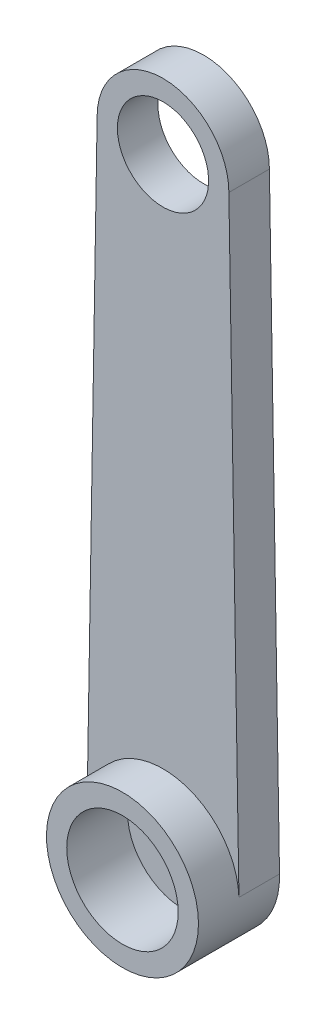
ISO-10303-21;
HEADER;
FILE_DESCRIPTION(('STEP AP214'),'2;1');
FILE_NAME('part.step','',(''),(''),'','','');
FILE_SCHEMA(('AUTOMOTIVE_DESIGN { 1 0 10303 214 1 1 1 1 }'));
ENDSEC;
DATA;
#1=APPLICATION_CONTEXT('core data for automotive mechanical design processes');
#2=APPLICATION_PROTOCOL_DEFINITION('international standard','automotive_design',2000,#1);
#3=PRODUCT_CONTEXT('',#1,'mechanical');
#4=PRODUCT('Part','Part','',(#3));
#5=PRODUCT_RELATED_PRODUCT_CATEGORY('part','',(#4));
#6=PRODUCT_DEFINITION_FORMATION('','',#4);
#7=PRODUCT_DEFINITION_CONTEXT('part definition',#1,'design');
#8=PRODUCT_DEFINITION('design','',#6,#7);
#9=PRODUCT_DEFINITION_SHAPE('','',#8);
#10=(LENGTH_UNIT() NAMED_UNIT(*) SI_UNIT(.MILLI.,.METRE.));
#11=(NAMED_UNIT(*) PLANE_ANGLE_UNIT() SI_UNIT($,.RADIAN.));
#12=(NAMED_UNIT(*) SI_UNIT($,.STERADIAN.) SOLID_ANGLE_UNIT());
#13=UNCERTAINTY_MEASURE_WITH_UNIT(LENGTH_MEASURE(1.E-05),#10,'distance_accuracy_value','');
#14=(GEOMETRIC_REPRESENTATION_CONTEXT(3) GLOBAL_UNCERTAINTY_ASSIGNED_CONTEXT((#13)) GLOBAL_UNIT_ASSIGNED_CONTEXT((#10,
#11,#12)) REPRESENTATION_CONTEXT('',''));
#15=CARTESIAN_POINT('',(0.,0.,0.));
#16=DIRECTION('',(0.,0.,1.));
#17=DIRECTION('',(1.,0.,0.));
#18=AXIS2_PLACEMENT_3D('',#15,#16,#17);
#19=CARTESIAN_POINT('',(0.,0.,4.));
#20=DIRECTION('',(0.,0.,-1.));
#21=DIRECTION('',(-1.,0.,0.));
#22=AXIS2_PLACEMENT_3D('',#19,#20,#21);
#23=CYLINDRICAL_SURFACE('',#22,2.75);
#24=CARTESIAN_POINT('',(0.,0.,4.));
#25=DIRECTION('',(0.,0.,1.));
#26=DIRECTION('',(1.,0.,0.));
#27=AXIS2_PLACEMENT_3D('',#24,#25,#26);
#28=CIRCLE('',#27,2.75);
#29=CARTESIAN_POINT('',(2.75,0.,4.));
#30=VERTEX_POINT('',#29);
#31=EDGE_CURVE('E43',#30,#30,#28,.T.);
#32=ORIENTED_EDGE('',*,*,#31,.T.);
#33=EDGE_LOOP('',(#32));
#34=FACE_BOUND('',#33,.T.);
#35=CARTESIAN_POINT('',(0.,0.,1.));
#36=DIRECTION('',(0.,0.,-1.));
#37=DIRECTION('',(-1.,0.,0.));
#38=AXIS2_PLACEMENT_3D('',#35,#36,#37);
#39=CIRCLE('',#38,2.75);
#40=CARTESIAN_POINT('',(-2.75,0.,1.));
#41=VERTEX_POINT('',#40);
#42=EDGE_CURVE('E109',#41,#41,#39,.F.);
#43=ORIENTED_EDGE('',*,*,#42,.F.);
#44=EDGE_LOOP('',(#43));
#45=FACE_BOUND('',#44,.T.);
#46=ADVANCED_FACE('F35',(#34,#45),#23,.F.);
#47=CARTESIAN_POINT('',(0.,0.,4.));
#48=DIRECTION('',(0.,0.,-1.));
#49=DIRECTION('',(-1.,0.,0.));
#50=AXIS2_PLACEMENT_3D('',#47,#48,#49);
#51=CYLINDRICAL_SURFACE('',#50,3.75);
#52=CARTESIAN_POINT('',(0.,0.,4.));
#53=DIRECTION('',(0.,0.,1.));
#54=DIRECTION('',(1.,0.,0.));
#55=AXIS2_PLACEMENT_3D('',#52,#53,#54);
#56=CIRCLE('',#55,3.75);
#57=CARTESIAN_POINT('',(3.75,0.,4.));
#58=VERTEX_POINT('',#57);
#59=EDGE_CURVE('E11',#58,#58,#56,.T.);
#60=ORIENTED_EDGE('',*,*,#59,.F.);
#61=EDGE_LOOP('',(#60));
#62=FACE_BOUND('',#61,.T.);
#63=DIRECTION('',(0.,0.,-1.));
#64=VECTOR('',#63,1.);
#65=CARTESIAN_POINT('',(-3.74791724520967,0.124965287420157,2.));
#66=LINE('',#65,#64);
#67=CARTESIAN_POINT('',(-3.74791724520967,0.124965287420157,2.));
#68=VERTEX_POINT('',#67);
#69=CARTESIAN_POINT('',(-3.74791724520967,0.124965287420157,0.));
#70=VERTEX_POINT('',#69);
#71=EDGE_CURVE('E91',#68,#70,#66,.T.);
#72=ORIENTED_EDGE('',*,*,#71,.T.);
#73=CARTESIAN_POINT('',(0.,0.,0.));
#74=DIRECTION('',(0.,0.,1.));
#75=DIRECTION('',(1.,0.,0.));
#76=AXIS2_PLACEMENT_3D('',#73,#74,#75);
#77=CIRCLE('',#76,3.75);
#78=CARTESIAN_POINT('',(3.74791724520966,0.124965287420212,0.));
#79=VERTEX_POINT('',#78);
#80=EDGE_CURVE('E38',#70,#79,#77,.T.);
#81=ORIENTED_EDGE('',*,*,#80,.T.);
#82=DIRECTION('',(0.,0.,-1.));
#83=VECTOR('',#82,1.);
#84=CARTESIAN_POINT('',(3.74791724520967,0.124965287420157,2.));
#85=LINE('',#84,#83);
#86=CARTESIAN_POINT('',(3.74791724520966,0.124965287420157,2.));
#87=VERTEX_POINT('',#86);
#88=EDGE_CURVE('E50',#87,#79,#85,.T.);
#89=ORIENTED_EDGE('',*,*,#88,.F.);
#90=CARTESIAN_POINT('',(0.,0.,2.));
#91=DIRECTION('',(0.,0.,-1.));
#92=DIRECTION('',(-1.,0.,0.));
#93=AXIS2_PLACEMENT_3D('',#90,#91,#92);
#94=CIRCLE('',#93,3.75);
#95=EDGE_CURVE('E54',#68,#87,#94,.T.);
#96=ORIENTED_EDGE('',*,*,#95,.F.);
#97=EDGE_LOOP('',(#72,#81,#89,#96));
#98=FACE_BOUND('',#97,.T.);
#99=ADVANCED_FACE('F122',(#62,#98),#51,.T.);
#100=CARTESIAN_POINT('',(0.,0.,4.));
#101=DIRECTION('',(0.,0.,1.));
#102=DIRECTION('',(1.,0.,0.));
#103=AXIS2_PLACEMENT_3D('',#100,#101,#102);
#104=PLANE('',#103);
#105=ORIENTED_EDGE('',*,*,#31,.F.);
#106=EDGE_LOOP('',(#105));
#107=FACE_BOUND('',#106,.T.);
#108=ORIENTED_EDGE('',*,*,#59,.T.);
#109=EDGE_LOOP('',(#108));
#110=FACE_BOUND('',#109,.T.);
#111=ADVANCED_FACE('F130',(#107,#110),#104,.T.);
#112=CARTESIAN_POINT('',(0.,0.,0.));
#113=DIRECTION('',(0.,0.,1.));
#114=DIRECTION('',(1.,0.,0.));
#115=AXIS2_PLACEMENT_3D('',#112,#113,#114);
#116=PLANE('',#115);
#117=ORIENTED_EDGE('',*,*,#80,.F.);
#118=DIRECTION('',(-0.0166643523339933,-0.9998611400396,0.));
#119=VECTOR('',#118,1.);
#120=CARTESIAN_POINT('',(-3.74895862260483,0.0624826437100805,0.));
#121=LINE('',#120,#119);
#122=CARTESIAN_POINT('',(-3.25,30.,0.));
#123=VERTEX_POINT('',#122);
#124=EDGE_CURVE('E107',#123,#70,#121,.T.);
#125=ORIENTED_EDGE('',*,*,#124,.F.);
#126=CARTESIAN_POINT('',(0.,30.,0.));
#127=DIRECTION('',(0.,0.,-1.));
#128=DIRECTION('',(-1.,0.,0.));
#129=AXIS2_PLACEMENT_3D('',#126,#127,#128);
#130=CIRCLE('',#129,3.25);
#131=CARTESIAN_POINT('',(3.25,30.,0.));
#132=VERTEX_POINT('',#131);
#133=EDGE_CURVE('E81',#123,#132,#130,.T.);
#134=ORIENTED_EDGE('',*,*,#133,.T.);
#135=DIRECTION('',(0.0166643523339933,-0.9998611400396,0.));
#136=VECTOR('',#135,1.);
#137=CARTESIAN_POINT('',(3.74895862260483,0.0624826437100805,0.));
#138=LINE('',#137,#136);
#139=EDGE_CURVE('E111',#132,#79,#138,.T.);
#140=ORIENTED_EDGE('',*,*,#139,.T.);
#141=EDGE_LOOP('',(#117,#125,#134,#140));
#142=FACE_BOUND('',#141,.T.);
#143=CARTESIAN_POINT('',(0.,30.,0.));
#144=DIRECTION('',(0.,0.,-1.));
#145=DIRECTION('',(-1.,0.,0.));
#146=AXIS2_PLACEMENT_3D('',#143,#144,#145);
#147=CIRCLE('',#146,2.25);
#148=CARTESIAN_POINT('',(-2.25,30.,0.));
#149=VERTEX_POINT('',#148);
#150=EDGE_CURVE('E93',#149,#149,#147,.T.);
#151=ORIENTED_EDGE('',*,*,#150,.F.);
#152=EDGE_LOOP('',(#151));
#153=FACE_BOUND('',#152,.T.);
#154=CARTESIAN_POINT('',(0.,0.,0.));
#155=DIRECTION('',(0.,0.,-1.));
#156=DIRECTION('',(-1.,0.,0.));
#157=AXIS2_PLACEMENT_3D('',#154,#155,#156);
#158=CIRCLE('',#157,1.5);
#159=CARTESIAN_POINT('',(-1.5,0.,0.));
#160=VERTEX_POINT('',#159);
#161=EDGE_CURVE('E136',#160,#160,#158,.T.);
#162=ORIENTED_EDGE('',*,*,#161,.F.);
#163=EDGE_LOOP('',(#162));
#164=FACE_BOUND('',#163,.T.);
#165=ADVANCED_FACE('F127',(#142,#153,#164),#116,.F.);
#166=CARTESIAN_POINT('',(-3.74895862260483,0.0624826437100805,2.));
#167=DIRECTION('',(0.9998611400396,-0.0166643523339933,0.));
#168=DIRECTION('',(0.0166643523339933,0.9998611400396,0.));
#169=AXIS2_PLACEMENT_3D('',#166,#167,#168);
#170=PLANE('',#169);
#171=ORIENTED_EDGE('',*,*,#124,.T.);
#172=ORIENTED_EDGE('',*,*,#71,.F.);
#173=DIRECTION('',(-0.0166643523339933,-0.9998611400396,0.));
#174=VECTOR('',#173,1.);
#175=CARTESIAN_POINT('',(-3.74895862260483,0.0624826437100805,2.));
#176=LINE('',#175,#174);
#177=CARTESIAN_POINT('',(-3.25,30.,2.));
#178=VERTEX_POINT('',#177);
#179=EDGE_CURVE('E89',#178,#68,#176,.T.);
#180=ORIENTED_EDGE('',*,*,#179,.F.);
#181=DIRECTION('',(0.,0.,-1.));
#182=VECTOR('',#181,1.);
#183=CARTESIAN_POINT('',(-3.25,30.,2.));
#184=LINE('',#183,#182);
#185=EDGE_CURVE('E75',#178,#123,#184,.T.);
#186=ORIENTED_EDGE('',*,*,#185,.T.);
#187=EDGE_LOOP('',(#171,#172,#180,#186));
#188=FACE_BOUND('',#187,.T.);
#189=ADVANCED_FACE('F90',(#188),#170,.F.);
#190=CARTESIAN_POINT('',(3.74895862260483,0.0624826437100805,2.));
#191=DIRECTION('',(0.9998611400396,0.0166643523339933,0.));
#192=DIRECTION('',(-0.0166643523339933,0.9998611400396,0.));
#193=AXIS2_PLACEMENT_3D('',#190,#191,#192);
#194=PLANE('',#193);
#195=ORIENTED_EDGE('',*,*,#139,.F.);
#196=DIRECTION('',(0.,0.,-1.));
#197=VECTOR('',#196,1.);
#198=CARTESIAN_POINT('',(3.25,30.,2.));
#199=LINE('',#198,#197);
#200=CARTESIAN_POINT('',(3.25,30.,2.));
#201=VERTEX_POINT('',#200);
#202=EDGE_CURVE('E85',#201,#132,#199,.T.);
#203=ORIENTED_EDGE('',*,*,#202,.F.);
#204=DIRECTION('',(0.0166643523339933,-0.9998611400396,0.));
#205=VECTOR('',#204,1.);
#206=CARTESIAN_POINT('',(3.74895862260483,0.0624826437100805,2.));
#207=LINE('',#206,#205);
#208=EDGE_CURVE('E99',#201,#87,#207,.T.);
#209=ORIENTED_EDGE('',*,*,#208,.T.);
#210=ORIENTED_EDGE('',*,*,#88,.T.);
#211=EDGE_LOOP('',(#195,#203,#209,#210));
#212=FACE_BOUND('',#211,.T.);
#213=ADVANCED_FACE('F126',(#212),#194,.T.);
#214=CARTESIAN_POINT('',(0.,30.,2.));
#215=DIRECTION('',(0.,0.,-1.));
#216=DIRECTION('',(-1.,0.,0.));
#217=AXIS2_PLACEMENT_3D('',#214,#215,#216);
#218=CYLINDRICAL_SURFACE('',#217,3.25);
#219=ORIENTED_EDGE('',*,*,#133,.F.);
#220=ORIENTED_EDGE('',*,*,#185,.F.);
#221=CARTESIAN_POINT('',(0.,30.,2.));
#222=DIRECTION('',(0.,0.,-1.));
#223=DIRECTION('',(-1.,0.,0.));
#224=AXIS2_PLACEMENT_3D('',#221,#222,#223);
#225=CIRCLE('',#224,3.25);
#226=EDGE_CURVE('E79',#178,#201,#225,.T.);
#227=ORIENTED_EDGE('',*,*,#226,.T.);
#228=ORIENTED_EDGE('',*,*,#202,.T.);
#229=EDGE_LOOP('',(#219,#220,#227,#228));
#230=FACE_BOUND('',#229,.T.);
#231=ADVANCED_FACE('F77',(#230),#218,.T.);
#232=CARTESIAN_POINT('',(0.,30.,2.));
#233=DIRECTION('',(0.,0.,-1.));
#234=DIRECTION('',(-1.,0.,0.));
#235=AXIS2_PLACEMENT_3D('',#232,#233,#234);
#236=CYLINDRICAL_SURFACE('',#235,2.25);
#237=CARTESIAN_POINT('',(0.,30.,2.));
#238=DIRECTION('',(0.,0.,-1.));
#239=DIRECTION('',(-1.,0.,0.));
#240=AXIS2_PLACEMENT_3D('',#237,#238,#239);
#241=CIRCLE('',#240,2.25);
#242=CARTESIAN_POINT('',(-2.25,30.,2.));
#243=VERTEX_POINT('',#242);
#244=EDGE_CURVE('E86',#243,#243,#241,.T.);
#245=ORIENTED_EDGE('',*,*,#244,.F.);
#246=EDGE_LOOP('',(#245));
#247=FACE_BOUND('',#246,.T.);
#248=ORIENTED_EDGE('',*,*,#150,.T.);
#249=EDGE_LOOP('',(#248));
#250=FACE_BOUND('',#249,.T.);
#251=ADVANCED_FACE('F163',(#247,#250),#236,.F.);
#252=CARTESIAN_POINT('',(0.,0.,2.));
#253=DIRECTION('',(0.,0.,-1.));
#254=DIRECTION('',(-1.,0.,0.));
#255=AXIS2_PLACEMENT_3D('',#252,#253,#254);
#256=PLANE('',#255);
#257=ORIENTED_EDGE('',*,*,#179,.T.);
#258=ORIENTED_EDGE('',*,*,#95,.T.);
#259=ORIENTED_EDGE('',*,*,#208,.F.);
#260=ORIENTED_EDGE('',*,*,#226,.F.);
#261=EDGE_LOOP('',(#257,#258,#259,#260));
#262=FACE_BOUND('',#261,.T.);
#263=ORIENTED_EDGE('',*,*,#244,.T.);
#264=EDGE_LOOP('',(#263));
#265=FACE_BOUND('',#264,.T.);
#266=ADVANCED_FACE('F96',(#262,#265),#256,.F.);
#267=CARTESIAN_POINT('',(0.,0.,1.));
#268=DIRECTION('',(0.,0.,-1.));
#269=DIRECTION('',(-1.,0.,0.));
#270=AXIS2_PLACEMENT_3D('',#267,#268,#269);
#271=CYLINDRICAL_SURFACE('',#270,1.5);
#272=CARTESIAN_POINT('',(0.,0.,1.));
#273=DIRECTION('',(0.,0.,-1.));
#274=DIRECTION('',(-1.,0.,0.));
#275=AXIS2_PLACEMENT_3D('',#272,#273,#274);
#276=CIRCLE('',#275,1.5);
#277=CARTESIAN_POINT('',(-1.5,0.,1.));
#278=VERTEX_POINT('',#277);
#279=EDGE_CURVE('E138',#278,#278,#276,.T.);
#280=ORIENTED_EDGE('',*,*,#279,.F.);
#281=EDGE_LOOP('',(#280));
#282=FACE_BOUND('',#281,.T.);
#283=ORIENTED_EDGE('',*,*,#161,.T.);
#284=EDGE_LOOP('',(#283));
#285=FACE_BOUND('',#284,.T.);
#286=ADVANCED_FACE('F171',(#282,#285),#271,.F.);
#287=CARTESIAN_POINT('',(0.,0.,1.));
#288=DIRECTION('',(0.,0.,-1.));
#289=DIRECTION('',(-1.,0.,0.));
#290=AXIS2_PLACEMENT_3D('',#287,#288,#289);
#291=PLANE('',#290);
#292=ORIENTED_EDGE('',*,*,#279,.T.);
#293=EDGE_LOOP('',(#292));
#294=FACE_BOUND('',#293,.T.);
#295=ORIENTED_EDGE('',*,*,#42,.T.);
#296=EDGE_LOOP('',(#295));
#297=FACE_BOUND('',#296,.T.);
#298=ADVANCED_FACE('F145',(#294,#297),#291,.F.);
#299=CLOSED_SHELL('',(#46,#99,#111,#165,#189,#213,#231,#251,#266,#286,#298));
#300=MANIFOLD_SOLID_BREP('B2',#299);
#301=ADVANCED_BREP_SHAPE_REPRESENTATION('',(#18,#300),#14);
#302=SHAPE_DEFINITION_REPRESENTATION(#9,#301);
ENDSEC;
END-ISO-10303-21;
